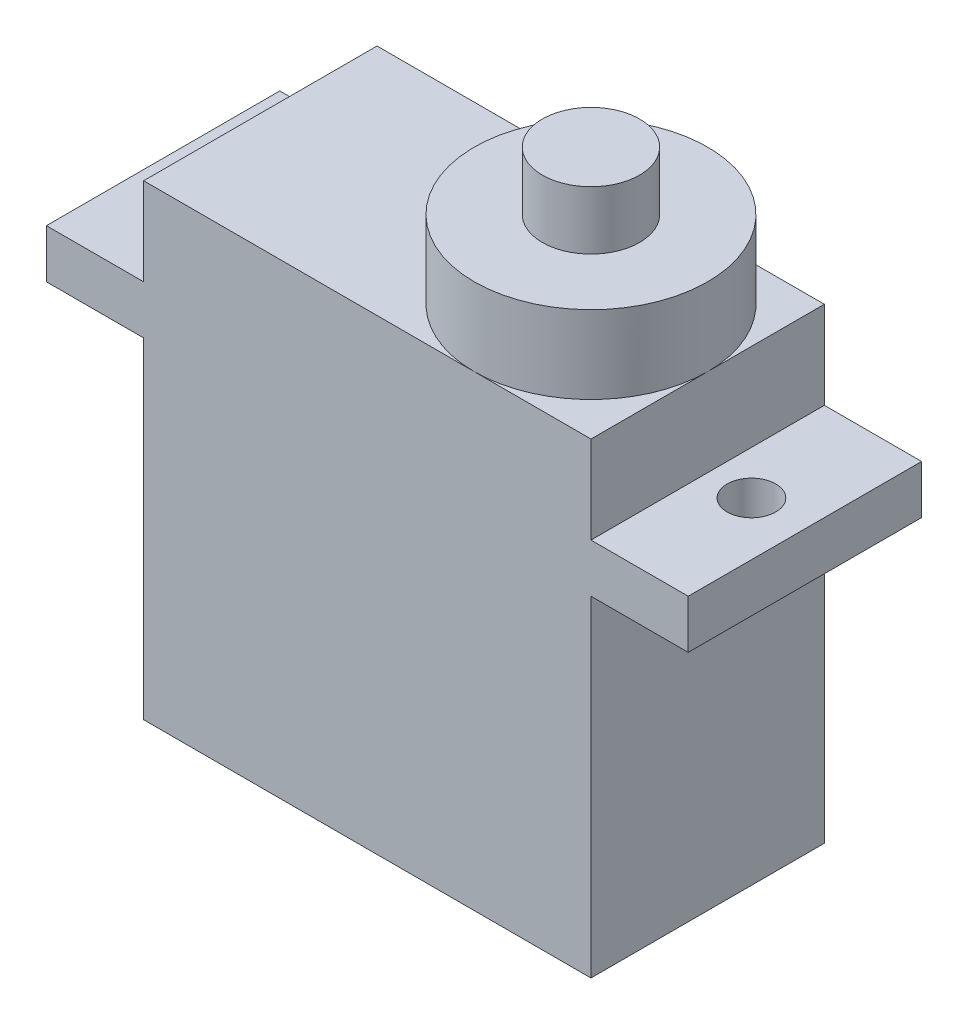
ISO-10303-21;
HEADER;
FILE_DESCRIPTION(('STEP AP214'),'2;1');
FILE_NAME('part.step','',(''),(''),'','','');
FILE_SCHEMA(('AUTOMOTIVE_DESIGN { 1 0 10303 214 1 1 1 1 }'));
ENDSEC;
DATA;
#1=APPLICATION_CONTEXT('core data for automotive mechanical design processes');
#2=APPLICATION_PROTOCOL_DEFINITION('international standard','automotive_design',2000,#1);
#3=PRODUCT_CONTEXT('',#1,'mechanical');
#4=PRODUCT('Part','Part','',(#3));
#5=PRODUCT_RELATED_PRODUCT_CATEGORY('part','',(#4));
#6=PRODUCT_DEFINITION_FORMATION('','',#4);
#7=PRODUCT_DEFINITION_CONTEXT('part definition',#1,'design');
#8=PRODUCT_DEFINITION('design','',#6,#7);
#9=PRODUCT_DEFINITION_SHAPE('','',#8);
#10=(LENGTH_UNIT() NAMED_UNIT(*) SI_UNIT(.MILLI.,.METRE.));
#11=(NAMED_UNIT(*) PLANE_ANGLE_UNIT() SI_UNIT($,.RADIAN.));
#12=(NAMED_UNIT(*) SI_UNIT($,.STERADIAN.) SOLID_ANGLE_UNIT());
#13=UNCERTAINTY_MEASURE_WITH_UNIT(LENGTH_MEASURE(1.E-05),#10,'distance_accuracy_value','');
#14=(GEOMETRIC_REPRESENTATION_CONTEXT(3) GLOBAL_UNCERTAINTY_ASSIGNED_CONTEXT((#13)) GLOBAL_UNIT_ASSIGNED_CONTEXT((#10,
#11,#12)) REPRESENTATION_CONTEXT('',''));
#15=CARTESIAN_POINT('',(0.,0.,0.));
#16=DIRECTION('',(0.,0.,1.));
#17=DIRECTION('',(1.,0.,0.));
#18=AXIS2_PLACEMENT_3D('',#15,#16,#17);
#19=CARTESIAN_POINT('',(0.,24.,0.));
#20=DIRECTION('',(0.,1.,0.));
#21=DIRECTION('',(0.,0.,1.));
#22=AXIS2_PLACEMENT_3D('',#19,#20,#21);
#23=PLANE('',#22);
#24=CARTESIAN_POINT('',(5.5,24.,0.));
#25=DIRECTION('',(0.,1.,0.));
#26=DIRECTION('',(0.,0.,1.));
#27=AXIS2_PLACEMENT_3D('',#24,#25,#26);
#28=CIRCLE('',#27,6.);
#29=CARTESIAN_POINT('',(5.5,24.,6.00000000000001));
#30=VERTEX_POINT('',#29);
#31=CARTESIAN_POINT('',(11.5,24.,0.));
#32=VERTEX_POINT('',#31);
#33=EDGE_CURVE('E154',#30,#32,#28,.T.);
#34=ORIENTED_EDGE('',*,*,#33,.F.);
#35=DIRECTION('',(1.,0.,0.));
#36=VECTOR('',#35,1.);
#37=CARTESIAN_POINT('',(-11.5,24.,6.));
#38=LINE('',#37,#36);
#39=CARTESIAN_POINT('',(11.5,24.,6.));
#40=VERTEX_POINT('',#39);
#41=EDGE_CURVE('E142',#30,#40,#38,.T.);
#42=ORIENTED_EDGE('',*,*,#41,.T.);
#43=DIRECTION('',(0.,0.,-1.));
#44=VECTOR('',#43,1.);
#45=CARTESIAN_POINT('',(11.5,24.,-6.));
#46=LINE('',#45,#44);
#47=EDGE_CURVE('E155',#40,#32,#46,.T.);
#48=ORIENTED_EDGE('',*,*,#47,.T.);
#49=EDGE_LOOP('',(#34,#42,#48));
#50=FACE_BOUND('',#49,.T.);
#51=ADVANCED_FACE('F35',(#50),#23,.T.);
#52=CARTESIAN_POINT('',(5.5,24.,-6.));
#53=VERTEX_POINT('',#52);
#54=EDGE_CURVE('E44',#32,#53,#28,.T.);
#55=ORIENTED_EDGE('',*,*,#54,.F.);
#56=CARTESIAN_POINT('',(11.5,24.,-6.));
#57=VERTEX_POINT('',#56);
#58=EDGE_CURVE('E223',#32,#57,#46,.T.);
#59=ORIENTED_EDGE('',*,*,#58,.T.);
#60=DIRECTION('',(-1.,0.,0.));
#61=VECTOR('',#60,1.);
#62=CARTESIAN_POINT('',(-11.5,24.,-6.));
#63=LINE('',#62,#61);
#64=EDGE_CURVE('E224',#57,#53,#63,.T.);
#65=ORIENTED_EDGE('',*,*,#64,.T.);
#66=EDGE_LOOP('',(#55,#59,#65));
#67=FACE_BOUND('',#66,.T.);
#68=ADVANCED_FACE('F285',(#67),#23,.T.);
#69=CARTESIAN_POINT('',(-11.5,24.,-6.));
#70=DIRECTION('',(1.,0.,0.));
#71=DIRECTION('',(0.,0.,-1.));
#72=AXIS2_PLACEMENT_3D('',#69,#70,#71);
#73=PLANE('',#72);
#74=DIRECTION('',(0.,0.,1.));
#75=VECTOR('',#74,1.);
#76=CARTESIAN_POINT('',(-11.5,17.,-6.));
#77=LINE('',#76,#75);
#78=CARTESIAN_POINT('',(-11.5,17.,-6.));
#79=VERTEX_POINT('',#78);
#80=CARTESIAN_POINT('',(-11.5,17.,6.));
#81=VERTEX_POINT('',#80);
#82=EDGE_CURVE('E171',#79,#81,#77,.T.);
#83=ORIENTED_EDGE('',*,*,#82,.F.);
#84=DIRECTION('',(0.,-1.,0.));
#85=VECTOR('',#84,1.);
#86=CARTESIAN_POINT('',(-11.5,24.,-6.));
#87=LINE('',#86,#85);
#88=CARTESIAN_POINT('',(-11.5,0.,-6.));
#89=VERTEX_POINT('',#88);
#90=EDGE_CURVE('E241',#79,#89,#87,.T.);
#91=ORIENTED_EDGE('',*,*,#90,.T.);
#92=DIRECTION('',(0.,0.,1.));
#93=VECTOR('',#92,1.);
#94=CARTESIAN_POINT('',(-11.5,0.,-6.));
#95=LINE('',#94,#93);
#96=CARTESIAN_POINT('',(-11.5,0.,6.));
#97=VERTEX_POINT('',#96);
#98=EDGE_CURVE('E232',#89,#97,#95,.T.);
#99=ORIENTED_EDGE('',*,*,#98,.T.);
#100=DIRECTION('',(0.,-1.,0.));
#101=VECTOR('',#100,1.);
#102=CARTESIAN_POINT('',(-11.5,24.,6.));
#103=LINE('',#102,#101);
#104=EDGE_CURVE('E238',#81,#97,#103,.T.);
#105=ORIENTED_EDGE('',*,*,#104,.F.);
#106=EDGE_LOOP('',(#83,#91,#99,#105));
#107=FACE_BOUND('',#106,.T.);
#108=ADVANCED_FACE('F290',(#107),#73,.F.);
#109=DIRECTION('',(0.,0.,-1.));
#110=VECTOR('',#109,1.);
#111=CARTESIAN_POINT('',(-11.5,19.5,-6.));
#112=LINE('',#111,#110);
#113=CARTESIAN_POINT('',(-11.5,19.5,6.));
#114=VERTEX_POINT('',#113);
#115=CARTESIAN_POINT('',(-11.5,19.5,-6.));
#116=VERTEX_POINT('',#115);
#117=EDGE_CURVE('E178',#114,#116,#112,.T.);
#118=ORIENTED_EDGE('',*,*,#117,.F.);
#119=CARTESIAN_POINT('',(-11.5,24.,6.));
#120=VERTEX_POINT('',#119);
#121=EDGE_CURVE('E239',#120,#114,#103,.T.);
#122=ORIENTED_EDGE('',*,*,#121,.F.);
#123=DIRECTION('',(0.,0.,1.));
#124=VECTOR('',#123,1.);
#125=CARTESIAN_POINT('',(-11.5,24.,-6.));
#126=LINE('',#125,#124);
#127=CARTESIAN_POINT('',(-11.5,24.,-6.));
#128=VERTEX_POINT('',#127);
#129=EDGE_CURVE('E137',#128,#120,#126,.T.);
#130=ORIENTED_EDGE('',*,*,#129,.F.);
#131=EDGE_CURVE('E242',#128,#116,#87,.T.);
#132=ORIENTED_EDGE('',*,*,#131,.T.);
#133=EDGE_LOOP('',(#118,#122,#130,#132));
#134=FACE_BOUND('',#133,.T.);
#135=ADVANCED_FACE('F310',(#134),#73,.F.);
#136=CARTESIAN_POINT('',(11.5,24.,-6.));
#137=DIRECTION('',(-1.,0.,0.));
#138=DIRECTION('',(0.,0.,1.));
#139=AXIS2_PLACEMENT_3D('',#136,#137,#138);
#140=PLANE('',#139);
#141=DIRECTION('',(0.,0.,-1.));
#142=VECTOR('',#141,1.);
#143=CARTESIAN_POINT('',(11.5,17.,6.));
#144=LINE('',#143,#142);
#145=CARTESIAN_POINT('',(11.5,17.,6.));
#146=VERTEX_POINT('',#145);
#147=CARTESIAN_POINT('',(11.5,17.,-6.));
#148=VERTEX_POINT('',#147);
#149=EDGE_CURVE('E199',#146,#148,#144,.T.);
#150=ORIENTED_EDGE('',*,*,#149,.F.);
#151=DIRECTION('',(0.,-1.,0.));
#152=VECTOR('',#151,1.);
#153=CARTESIAN_POINT('',(11.5,24.,6.));
#154=LINE('',#153,#152);
#155=CARTESIAN_POINT('',(11.5,0.,6.));
#156=VERTEX_POINT('',#155);
#157=EDGE_CURVE('E141',#146,#156,#154,.T.);
#158=ORIENTED_EDGE('',*,*,#157,.T.);
#159=DIRECTION('',(0.,0.,-1.));
#160=VECTOR('',#159,1.);
#161=CARTESIAN_POINT('',(11.5,0.,-6.));
#162=LINE('',#161,#160);
#163=CARTESIAN_POINT('',(11.5,0.,-6.));
#164=VERTEX_POINT('',#163);
#165=EDGE_CURVE('E220',#156,#164,#162,.T.);
#166=ORIENTED_EDGE('',*,*,#165,.T.);
#167=DIRECTION('',(0.,-1.,0.));
#168=VECTOR('',#167,1.);
#169=CARTESIAN_POINT('',(11.5,24.,-6.));
#170=LINE('',#169,#168);
#171=EDGE_CURVE('E163',#148,#164,#170,.T.);
#172=ORIENTED_EDGE('',*,*,#171,.F.);
#173=EDGE_LOOP('',(#150,#158,#166,#172));
#174=FACE_BOUND('',#173,.T.);
#175=ADVANCED_FACE('F37',(#174),#140,.F.);
#176=DIRECTION('',(0.,0.,1.));
#177=VECTOR('',#176,1.);
#178=CARTESIAN_POINT('',(11.5,19.5,6.));
#179=LINE('',#178,#177);
#180=CARTESIAN_POINT('',(11.5,19.5,-6.));
#181=VERTEX_POINT('',#180);
#182=CARTESIAN_POINT('',(11.5,19.5,6.));
#183=VERTEX_POINT('',#182);
#184=EDGE_CURVE('E194',#181,#183,#179,.T.);
#185=ORIENTED_EDGE('',*,*,#184,.F.);
#186=EDGE_CURVE('E161',#57,#181,#170,.T.);
#187=ORIENTED_EDGE('',*,*,#186,.F.);
#188=ORIENTED_EDGE('',*,*,#58,.F.);
#189=ORIENTED_EDGE('',*,*,#47,.F.);
#190=EDGE_CURVE('E149',#40,#183,#154,.T.);
#191=ORIENTED_EDGE('',*,*,#190,.T.);
#192=EDGE_LOOP('',(#185,#187,#188,#189,#191));
#193=FACE_BOUND('',#192,.T.);
#194=ADVANCED_FACE('F306',(#193),#140,.F.);
#195=CARTESIAN_POINT('',(-11.5,24.,-6.));
#196=DIRECTION('',(0.,0.,1.));
#197=DIRECTION('',(1.,0.,0.));
#198=AXIS2_PLACEMENT_3D('',#195,#196,#197);
#199=PLANE('',#198);
#200=DIRECTION('',(-1.,0.,0.));
#201=VECTOR('',#200,1.);
#202=CARTESIAN_POINT('',(-11.5,0.,-6.));
#203=LINE('',#202,#201);
#204=EDGE_CURVE('E229',#164,#89,#203,.T.);
#205=ORIENTED_EDGE('',*,*,#204,.T.);
#206=ORIENTED_EDGE('',*,*,#90,.F.);
#207=DIRECTION('',(1.,0.,0.));
#208=VECTOR('',#207,1.);
#209=CARTESIAN_POINT('',(-16.5,17.,-6.));
#210=LINE('',#209,#208);
#211=CARTESIAN_POINT('',(-16.5,17.,-6.));
#212=VERTEX_POINT('',#211);
#213=EDGE_CURVE('E185',#212,#79,#210,.T.);
#214=ORIENTED_EDGE('',*,*,#213,.F.);
#215=DIRECTION('',(0.,-1.,0.));
#216=VECTOR('',#215,1.);
#217=CARTESIAN_POINT('',(-16.5,19.5,-6.));
#218=LINE('',#217,#216);
#219=CARTESIAN_POINT('',(-16.5,19.5,-6.));
#220=VERTEX_POINT('',#219);
#221=EDGE_CURVE('E173',#220,#212,#218,.T.);
#222=ORIENTED_EDGE('',*,*,#221,.F.);
#223=DIRECTION('',(1.,0.,0.));
#224=VECTOR('',#223,1.);
#225=CARTESIAN_POINT('',(-16.5,19.5,-6.));
#226=LINE('',#225,#224);
#227=EDGE_CURVE('E188',#220,#116,#226,.T.);
#228=ORIENTED_EDGE('',*,*,#227,.T.);
#229=ORIENTED_EDGE('',*,*,#131,.F.);
#230=EDGE_CURVE('E222',#53,#128,#63,.T.);
#231=ORIENTED_EDGE('',*,*,#230,.F.);
#232=ORIENTED_EDGE('',*,*,#64,.F.);
#233=ORIENTED_EDGE('',*,*,#186,.T.);
#234=DIRECTION('',(-1.,0.,0.));
#235=VECTOR('',#234,1.);
#236=CARTESIAN_POINT('',(16.5,19.5,-6.));
#237=LINE('',#236,#235);
#238=CARTESIAN_POINT('',(16.5,19.5,-6.));
#239=VERTEX_POINT('',#238);
#240=EDGE_CURVE('E217',#239,#181,#237,.T.);
#241=ORIENTED_EDGE('',*,*,#240,.F.);
#242=DIRECTION('',(0.,1.,0.));
#243=VECTOR('',#242,1.);
#244=CARTESIAN_POINT('',(16.5,19.5,-6.));
#245=LINE('',#244,#243);
#246=CARTESIAN_POINT('',(16.5,17.,-6.));
#247=VERTEX_POINT('',#246);
#248=EDGE_CURVE('E195',#247,#239,#245,.T.);
#249=ORIENTED_EDGE('',*,*,#248,.F.);
#250=DIRECTION('',(-1.,0.,0.));
#251=VECTOR('',#250,1.);
#252=CARTESIAN_POINT('',(16.5,17.,-6.));
#253=LINE('',#252,#251);
#254=EDGE_CURVE('E205',#247,#148,#253,.T.);
#255=ORIENTED_EDGE('',*,*,#254,.T.);
#256=ORIENTED_EDGE('',*,*,#171,.T.);
#257=EDGE_LOOP('',(#205,#206,#214,#222,#228,#229,#231,#232,#233,#241,#249,#255,#256));
#258=FACE_BOUND('',#257,.T.);
#259=ADVANCED_FACE('F301',(#258),#199,.F.);
#260=CARTESIAN_POINT('',(-11.5,24.,6.));
#261=DIRECTION('',(0.,0.,-1.));
#262=DIRECTION('',(-1.,0.,0.));
#263=AXIS2_PLACEMENT_3D('',#260,#261,#262);
#264=PLANE('',#263);
#265=DIRECTION('',(1.,0.,0.));
#266=VECTOR('',#265,1.);
#267=CARTESIAN_POINT('',(-11.5,0.,6.));
#268=LINE('',#267,#266);
#269=EDGE_CURVE('E235',#97,#156,#268,.T.);
#270=ORIENTED_EDGE('',*,*,#269,.T.);
#271=ORIENTED_EDGE('',*,*,#157,.F.);
#272=DIRECTION('',(-1.,0.,0.));
#273=VECTOR('',#272,1.);
#274=CARTESIAN_POINT('',(16.5,17.,6.));
#275=LINE('',#274,#273);
#276=CARTESIAN_POINT('',(16.5,17.,6.));
#277=VERTEX_POINT('',#276);
#278=EDGE_CURVE('E212',#277,#146,#275,.T.);
#279=ORIENTED_EDGE('',*,*,#278,.F.);
#280=DIRECTION('',(0.,-1.,0.));
#281=VECTOR('',#280,1.);
#282=CARTESIAN_POINT('',(16.5,19.5,6.));
#283=LINE('',#282,#281);
#284=CARTESIAN_POINT('',(16.5,19.5,6.));
#285=VERTEX_POINT('',#284);
#286=EDGE_CURVE('E201',#285,#277,#283,.T.);
#287=ORIENTED_EDGE('',*,*,#286,.F.);
#288=DIRECTION('',(-1.,0.,0.));
#289=VECTOR('',#288,1.);
#290=CARTESIAN_POINT('',(16.5,19.5,6.));
#291=LINE('',#290,#289);
#292=EDGE_CURVE('E215',#285,#183,#291,.T.);
#293=ORIENTED_EDGE('',*,*,#292,.T.);
#294=ORIENTED_EDGE('',*,*,#190,.F.);
#295=ORIENTED_EDGE('',*,*,#41,.F.);
#296=EDGE_CURVE('E133',#120,#30,#38,.T.);
#297=ORIENTED_EDGE('',*,*,#296,.F.);
#298=ORIENTED_EDGE('',*,*,#121,.T.);
#299=DIRECTION('',(1.,0.,0.));
#300=VECTOR('',#299,1.);
#301=CARTESIAN_POINT('',(-16.5,19.5,6.));
#302=LINE('',#301,#300);
#303=CARTESIAN_POINT('',(-16.5,19.5,6.));
#304=VERTEX_POINT('',#303);
#305=EDGE_CURVE('E191',#304,#114,#302,.T.);
#306=ORIENTED_EDGE('',*,*,#305,.F.);
#307=DIRECTION('',(0.,1.,0.));
#308=VECTOR('',#307,1.);
#309=CARTESIAN_POINT('',(-16.5,19.5,6.));
#310=LINE('',#309,#308);
#311=CARTESIAN_POINT('',(-16.5,17.,6.));
#312=VERTEX_POINT('',#311);
#313=EDGE_CURVE('E167',#312,#304,#310,.T.);
#314=ORIENTED_EDGE('',*,*,#313,.F.);
#315=DIRECTION('',(1.,0.,0.));
#316=VECTOR('',#315,1.);
#317=CARTESIAN_POINT('',(-16.5,17.,6.));
#318=LINE('',#317,#316);
#319=EDGE_CURVE('E177',#312,#81,#318,.T.);
#320=ORIENTED_EDGE('',*,*,#319,.T.);
#321=ORIENTED_EDGE('',*,*,#104,.T.);
#322=EDGE_LOOP('',(#270,#271,#279,#287,#293,#294,#295,#297,#298,#306,#314,#320,#321));
#323=FACE_BOUND('',#322,.T.);
#324=ADVANCED_FACE('F147',(#323),#264,.F.);
#325=EDGE_CURVE('E52',#53,#30,#28,.T.);
#326=ORIENTED_EDGE('',*,*,#325,.F.);
#327=ORIENTED_EDGE('',*,*,#230,.T.);
#328=ORIENTED_EDGE('',*,*,#129,.T.);
#329=ORIENTED_EDGE('',*,*,#296,.T.);
#330=EDGE_LOOP('',(#326,#327,#328,#329));
#331=FACE_BOUND('',#330,.T.);
#332=ADVANCED_FACE('F135',(#331),#23,.T.);
#333=CARTESIAN_POINT('',(0.,0.,0.));
#334=DIRECTION('',(0.,1.,0.));
#335=DIRECTION('',(0.,0.,1.));
#336=AXIS2_PLACEMENT_3D('',#333,#334,#335);
#337=PLANE('',#336);
#338=ORIENTED_EDGE('',*,*,#165,.F.);
#339=ORIENTED_EDGE('',*,*,#269,.F.);
#340=ORIENTED_EDGE('',*,*,#98,.F.);
#341=ORIENTED_EDGE('',*,*,#204,.F.);
#342=EDGE_LOOP('',(#338,#339,#340,#341));
#343=FACE_BOUND('',#342,.T.);
#344=ADVANCED_FACE('F294',(#343),#337,.F.);
#345=CARTESIAN_POINT('',(16.5,19.5,6.));
#346=DIRECTION('',(0.,-1.,0.));
#347=DIRECTION('',(0.,0.,-1.));
#348=AXIS2_PLACEMENT_3D('',#345,#346,#347);
#349=PLANE('',#348);
#350=CARTESIAN_POINT('',(13.75,19.5,0.));
#351=DIRECTION('',(0.,1.,0.));
#352=DIRECTION('',(0.,0.,1.));
#353=AXIS2_PLACEMENT_3D('',#350,#351,#352);
#354=CIRCLE('',#353,1.25);
#355=CARTESIAN_POINT('',(13.75,19.5,1.25));
#356=VERTEX_POINT('',#355);
#357=EDGE_CURVE('E245',#356,#356,#354,.T.);
#358=ORIENTED_EDGE('',*,*,#357,.F.);
#359=EDGE_LOOP('',(#358));
#360=FACE_BOUND('',#359,.T.);
#361=ORIENTED_EDGE('',*,*,#184,.T.);
#362=ORIENTED_EDGE('',*,*,#292,.F.);
#363=DIRECTION('',(0.,0.,1.));
#364=VECTOR('',#363,1.);
#365=CARTESIAN_POINT('',(16.5,19.5,6.));
#366=LINE('',#365,#364);
#367=EDGE_CURVE('E198',#239,#285,#366,.T.);
#368=ORIENTED_EDGE('',*,*,#367,.F.);
#369=ORIENTED_EDGE('',*,*,#240,.T.);
#370=EDGE_LOOP('',(#361,#362,#368,#369));
#371=FACE_BOUND('',#370,.T.);
#372=ADVANCED_FACE('F299',(#360,#371),#349,.F.);
#373=CARTESIAN_POINT('',(16.5,17.,6.));
#374=DIRECTION('',(0.,1.,0.));
#375=DIRECTION('',(0.,0.,1.));
#376=AXIS2_PLACEMENT_3D('',#373,#374,#375);
#377=PLANE('',#376);
#378=CARTESIAN_POINT('',(13.75,17.,0.));
#379=DIRECTION('',(0.,1.,0.));
#380=DIRECTION('',(0.,0.,1.));
#381=AXIS2_PLACEMENT_3D('',#378,#379,#380);
#382=CIRCLE('',#381,1.25);
#383=CARTESIAN_POINT('',(13.75,17.,1.25));
#384=VERTEX_POINT('',#383);
#385=EDGE_CURVE('E39',#384,#384,#382,.T.);
#386=ORIENTED_EDGE('',*,*,#385,.T.);
#387=EDGE_LOOP('',(#386));
#388=FACE_BOUND('',#387,.T.);
#389=ORIENTED_EDGE('',*,*,#149,.T.);
#390=ORIENTED_EDGE('',*,*,#254,.F.);
#391=DIRECTION('',(0.,0.,-1.));
#392=VECTOR('',#391,1.);
#393=CARTESIAN_POINT('',(16.5,17.,6.));
#394=LINE('',#393,#392);
#395=EDGE_CURVE('E203',#277,#247,#394,.T.);
#396=ORIENTED_EDGE('',*,*,#395,.F.);
#397=ORIENTED_EDGE('',*,*,#278,.T.);
#398=EDGE_LOOP('',(#389,#390,#396,#397));
#399=FACE_BOUND('',#398,.T.);
#400=ADVANCED_FACE('F338',(#388,#399),#377,.F.);
#401=CARTESIAN_POINT('',(16.5,0.,0.));
#402=DIRECTION('',(1.,0.,0.));
#403=DIRECTION('',(0.,0.,-1.));
#404=AXIS2_PLACEMENT_3D('',#401,#402,#403);
#405=PLANE('',#404);
#406=ORIENTED_EDGE('',*,*,#248,.T.);
#407=ORIENTED_EDGE('',*,*,#367,.T.);
#408=ORIENTED_EDGE('',*,*,#286,.T.);
#409=ORIENTED_EDGE('',*,*,#395,.T.);
#410=EDGE_LOOP('',(#406,#407,#408,#409));
#411=FACE_BOUND('',#410,.T.);
#412=ADVANCED_FACE('F342',(#411),#405,.T.);
#413=CARTESIAN_POINT('',(-16.5,19.5,-6.));
#414=DIRECTION('',(0.,-1.,0.));
#415=DIRECTION('',(0.,0.,-1.));
#416=AXIS2_PLACEMENT_3D('',#413,#414,#415);
#417=PLANE('',#416);
#418=CARTESIAN_POINT('',(-13.75,19.5,0.));
#419=DIRECTION('',(0.,1.,0.));
#420=DIRECTION('',(0.,0.,1.));
#421=AXIS2_PLACEMENT_3D('',#418,#419,#420);
#422=CIRCLE('',#421,1.25);
#423=CARTESIAN_POINT('',(-13.75,19.5,1.25));
#424=VERTEX_POINT('',#423);
#425=EDGE_CURVE('E250',#424,#424,#422,.T.);
#426=ORIENTED_EDGE('',*,*,#425,.F.);
#427=EDGE_LOOP('',(#426));
#428=FACE_BOUND('',#427,.T.);
#429=ORIENTED_EDGE('',*,*,#117,.T.);
#430=ORIENTED_EDGE('',*,*,#227,.F.);
#431=DIRECTION('',(0.,0.,-1.));
#432=VECTOR('',#431,1.);
#433=CARTESIAN_POINT('',(-16.5,19.5,-6.));
#434=LINE('',#433,#432);
#435=EDGE_CURVE('E170',#304,#220,#434,.T.);
#436=ORIENTED_EDGE('',*,*,#435,.F.);
#437=ORIENTED_EDGE('',*,*,#305,.T.);
#438=EDGE_LOOP('',(#429,#430,#436,#437));
#439=FACE_BOUND('',#438,.T.);
#440=ADVANCED_FACE('F329',(#428,#439),#417,.F.);
#441=CARTESIAN_POINT('',(-16.5,17.,-6.));
#442=DIRECTION('',(0.,1.,0.));
#443=DIRECTION('',(0.,0.,1.));
#444=AXIS2_PLACEMENT_3D('',#441,#442,#443);
#445=PLANE('',#444);
#446=CARTESIAN_POINT('',(-13.75,17.,0.));
#447=DIRECTION('',(0.,1.,0.));
#448=DIRECTION('',(0.,0.,1.));
#449=AXIS2_PLACEMENT_3D('',#446,#447,#448);
#450=CIRCLE('',#449,1.25);
#451=CARTESIAN_POINT('',(-13.75,17.,1.25));
#452=VERTEX_POINT('',#451);
#453=EDGE_CURVE('E243',#452,#452,#450,.T.);
#454=ORIENTED_EDGE('',*,*,#453,.T.);
#455=EDGE_LOOP('',(#454));
#456=FACE_BOUND('',#455,.T.);
#457=ORIENTED_EDGE('',*,*,#82,.T.);
#458=ORIENTED_EDGE('',*,*,#319,.F.);
#459=DIRECTION('',(0.,0.,1.));
#460=VECTOR('',#459,1.);
#461=CARTESIAN_POINT('',(-16.5,17.,-6.));
#462=LINE('',#461,#460);
#463=EDGE_CURVE('E175',#212,#312,#462,.T.);
#464=ORIENTED_EDGE('',*,*,#463,.F.);
#465=ORIENTED_EDGE('',*,*,#213,.T.);
#466=EDGE_LOOP('',(#457,#458,#464,#465));
#467=FACE_BOUND('',#466,.T.);
#468=ADVANCED_FACE('F281',(#456,#467),#445,.F.);
#469=CARTESIAN_POINT('',(-16.5,0.,0.));
#470=DIRECTION('',(-1.,0.,0.));
#471=DIRECTION('',(0.,0.,1.));
#472=AXIS2_PLACEMENT_3D('',#469,#470,#471);
#473=PLANE('',#472);
#474=ORIENTED_EDGE('',*,*,#313,.T.);
#475=ORIENTED_EDGE('',*,*,#435,.T.);
#476=ORIENTED_EDGE('',*,*,#221,.T.);
#477=ORIENTED_EDGE('',*,*,#463,.T.);
#478=EDGE_LOOP('',(#474,#475,#476,#477));
#479=FACE_BOUND('',#478,.T.);
#480=ADVANCED_FACE('F276',(#479),#473,.T.);
#481=CARTESIAN_POINT('',(5.5,28.,0.));
#482=DIRECTION('',(0.,-1.,0.));
#483=DIRECTION('',(0.,0.,-1.));
#484=AXIS2_PLACEMENT_3D('',#481,#482,#483);
#485=CYLINDRICAL_SURFACE('',#484,6.);
#486=CARTESIAN_POINT('',(5.5,28.,0.));
#487=DIRECTION('',(0.,1.,0.));
#488=DIRECTION('',(0.,0.,1.));
#489=AXIS2_PLACEMENT_3D('',#486,#487,#488);
#490=CIRCLE('',#489,6.);
#491=CARTESIAN_POINT('',(5.5,28.,6.00000000000001));
#492=VERTEX_POINT('',#491);
#493=EDGE_CURVE('E157',#492,#492,#490,.T.);
#494=ORIENTED_EDGE('',*,*,#493,.F.);
#495=EDGE_LOOP('',(#494));
#496=FACE_BOUND('',#495,.T.);
#497=ORIENTED_EDGE('',*,*,#33,.T.);
#498=ORIENTED_EDGE('',*,*,#54,.T.);
#499=ORIENTED_EDGE('',*,*,#325,.T.);
#500=EDGE_LOOP('',(#497,#498,#499));
#501=FACE_BOUND('',#500,.T.);
#502=ADVANCED_FACE('F160',(#496,#501),#485,.T.);
#503=CARTESIAN_POINT('',(5.5,28.,0.));
#504=DIRECTION('',(0.,1.,0.));
#505=DIRECTION('',(0.,0.,1.));
#506=AXIS2_PLACEMENT_3D('',#503,#504,#505);
#507=PLANE('',#506);
#508=CARTESIAN_POINT('',(5.5,28.,0.));
#509=DIRECTION('',(0.,1.,0.));
#510=DIRECTION('',(0.,0.,1.));
#511=AXIS2_PLACEMENT_3D('',#508,#509,#510);
#512=CIRCLE('',#511,2.5);
#513=CARTESIAN_POINT('',(5.5,28.,2.5));
#514=VERTEX_POINT('',#513);
#515=EDGE_CURVE('E11',#514,#514,#512,.T.);
#516=ORIENTED_EDGE('',*,*,#515,.F.);
#517=EDGE_LOOP('',(#516));
#518=FACE_BOUND('',#517,.T.);
#519=ORIENTED_EDGE('',*,*,#493,.T.);
#520=EDGE_LOOP('',(#519));
#521=FACE_BOUND('',#520,.T.);
#522=ADVANCED_FACE('F265',(#518,#521),#507,.T.);
#523=CARTESIAN_POINT('',(5.5,31.,0.));
#524=DIRECTION('',(0.,-1.,0.));
#525=DIRECTION('',(0.,0.,-1.));
#526=AXIS2_PLACEMENT_3D('',#523,#524,#525);
#527=CYLINDRICAL_SURFACE('',#526,2.5);
#528=CARTESIAN_POINT('',(5.5,31.,0.));
#529=DIRECTION('',(0.,1.,0.));
#530=DIRECTION('',(0.,0.,1.));
#531=AXIS2_PLACEMENT_3D('',#528,#529,#530);
#532=CIRCLE('',#531,2.5);
#533=CARTESIAN_POINT('',(5.5,31.,2.5));
#534=VERTEX_POINT('',#533);
#535=EDGE_CURVE('E158',#534,#534,#532,.T.);
#536=ORIENTED_EDGE('',*,*,#535,.F.);
#537=EDGE_LOOP('',(#536));
#538=FACE_BOUND('',#537,.T.);
#539=ORIENTED_EDGE('',*,*,#515,.T.);
#540=EDGE_LOOP('',(#539));
#541=FACE_BOUND('',#540,.T.);
#542=ADVANCED_FACE('F262',(#538,#541),#527,.T.);
#543=CARTESIAN_POINT('',(5.5,31.,0.));
#544=DIRECTION('',(0.,1.,0.));
#545=DIRECTION('',(0.,0.,1.));
#546=AXIS2_PLACEMENT_3D('',#543,#544,#545);
#547=PLANE('',#546);
#548=ORIENTED_EDGE('',*,*,#535,.T.);
#549=EDGE_LOOP('',(#548));
#550=FACE_BOUND('',#549,.T.);
#551=ADVANCED_FACE('F260',(#550),#547,.T.);
#552=CARTESIAN_POINT('',(-13.75,16.5,0.));
#553=DIRECTION('',(0.,1.,0.));
#554=DIRECTION('',(0.,0.,1.));
#555=AXIS2_PLACEMENT_3D('',#552,#553,#554);
#556=CYLINDRICAL_SURFACE('',#555,1.25);
#557=ORIENTED_EDGE('',*,*,#425,.T.);
#558=EDGE_LOOP('',(#557));
#559=FACE_BOUND('',#558,.T.);
#560=ORIENTED_EDGE('',*,*,#453,.F.);
#561=EDGE_LOOP('',(#560));
#562=FACE_BOUND('',#561,.T.);
#563=ADVANCED_FACE('F430',(#559,#562),#556,.F.);
#564=CARTESIAN_POINT('',(13.75,16.5,0.));
#565=DIRECTION('',(0.,1.,0.));
#566=DIRECTION('',(0.,0.,1.));
#567=AXIS2_PLACEMENT_3D('',#564,#565,#566);
#568=CYLINDRICAL_SURFACE('',#567,1.25);
#569=ORIENTED_EDGE('',*,*,#357,.T.);
#570=EDGE_LOOP('',(#569));
#571=FACE_BOUND('',#570,.T.);
#572=ORIENTED_EDGE('',*,*,#385,.F.);
#573=EDGE_LOOP('',(#572));
#574=FACE_BOUND('',#573,.T.);
#575=ADVANCED_FACE('F471',(#571,#574),#568,.F.);
#576=CLOSED_SHELL('',(#51,#68,#108,#135,#175,#194,#259,#324,#332,#344,#372,#400,#412,#440,#468,
#480,#502,#522,#542,#551,#563,#575));
#577=MANIFOLD_SOLID_BREP('B2',#576);
#578=ADVANCED_BREP_SHAPE_REPRESENTATION('',(#18,#577),#14);
#579=SHAPE_DEFINITION_REPRESENTATION(#9,#578);
ENDSEC;
END-ISO-10303-21;
